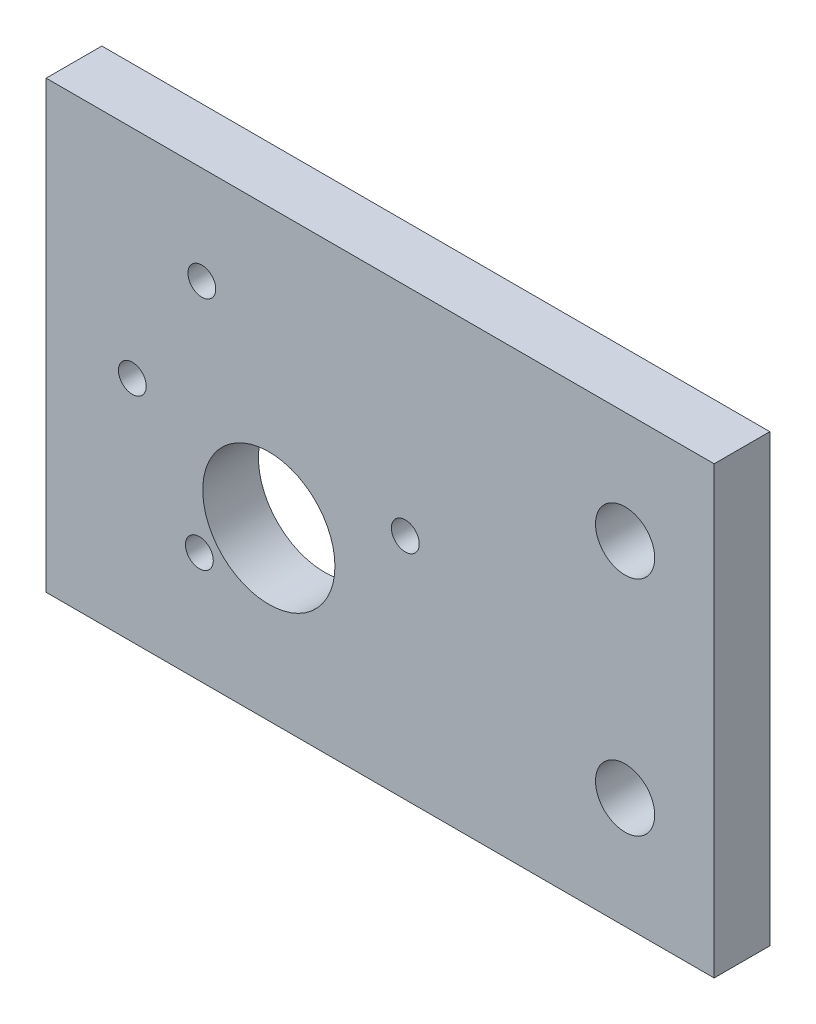
ISO-10303-21;
HEADER;
FILE_DESCRIPTION(('STEP AP214'),'2;1');
FILE_NAME('part.step','',(''),(''),'','','');
FILE_SCHEMA(('AUTOMOTIVE_DESIGN { 1 0 10303 214 1 1 1 1 }'));
ENDSEC;
DATA;
#1=APPLICATION_CONTEXT('core data for automotive mechanical design processes');
#2=APPLICATION_PROTOCOL_DEFINITION('international standard','automotive_design',2000,#1);
#3=PRODUCT_CONTEXT('',#1,'mechanical');
#4=PRODUCT('Part','Part','',(#3));
#5=PRODUCT_RELATED_PRODUCT_CATEGORY('part','',(#4));
#6=PRODUCT_DEFINITION_FORMATION('','',#4);
#7=PRODUCT_DEFINITION_CONTEXT('part definition',#1,'design');
#8=PRODUCT_DEFINITION('design','',#6,#7);
#9=PRODUCT_DEFINITION_SHAPE('','',#8);
#10=(LENGTH_UNIT() NAMED_UNIT(*) SI_UNIT(.MILLI.,.METRE.));
#11=(NAMED_UNIT(*) PLANE_ANGLE_UNIT() SI_UNIT($,.RADIAN.));
#12=(NAMED_UNIT(*) SI_UNIT($,.STERADIAN.) SOLID_ANGLE_UNIT());
#13=UNCERTAINTY_MEASURE_WITH_UNIT(LENGTH_MEASURE(1.E-05),#10,'distance_accuracy_value','');
#14=(GEOMETRIC_REPRESENTATION_CONTEXT(3) GLOBAL_UNCERTAINTY_ASSIGNED_CONTEXT((#13)) GLOBAL_UNIT_ASSIGNED_CONTEXT((#10,
#11,#12)) REPRESENTATION_CONTEXT('',''));
#15=CARTESIAN_POINT('',(0.,0.,0.));
#16=DIRECTION('',(0.,0.,1.));
#17=DIRECTION('',(1.,0.,0.));
#18=AXIS2_PLACEMENT_3D('',#15,#16,#17);
#19=CARTESIAN_POINT('',(38.1,25.4,6.35));
#20=DIRECTION('',(-1.,0.,0.));
#21=DIRECTION('',(0.,0.,1.));
#22=AXIS2_PLACEMENT_3D('',#19,#20,#21);
#23=PLANE('',#22);
#24=DIRECTION('',(0.,1.,0.));
#25=VECTOR('',#24,1.);
#26=CARTESIAN_POINT('',(38.1,25.4,0.));
#27=LINE('',#26,#25);
#28=CARTESIAN_POINT('',(38.1,-25.4,0.));
#29=VERTEX_POINT('',#28);
#30=CARTESIAN_POINT('',(38.1,25.4,0.));
#31=VERTEX_POINT('',#30);
#32=EDGE_CURVE('E95',#29,#31,#27,.T.);
#33=ORIENTED_EDGE('',*,*,#32,.T.);
#34=DIRECTION('',(0.,0.,-1.));
#35=VECTOR('',#34,1.);
#36=CARTESIAN_POINT('',(38.1,25.4,6.35));
#37=LINE('',#36,#35);
#38=CARTESIAN_POINT('',(38.1,25.4,6.35));
#39=VERTEX_POINT('',#38);
#40=EDGE_CURVE('E11',#39,#31,#37,.T.);
#41=ORIENTED_EDGE('',*,*,#40,.F.);
#42=DIRECTION('',(0.,1.,0.));
#43=VECTOR('',#42,1.);
#44=CARTESIAN_POINT('',(38.1,25.4,6.35));
#45=LINE('',#44,#43);
#46=CARTESIAN_POINT('',(38.1,-25.4,6.35));
#47=VERTEX_POINT('',#46);
#48=EDGE_CURVE('E83',#47,#39,#45,.T.);
#49=ORIENTED_EDGE('',*,*,#48,.F.);
#50=DIRECTION('',(0.,0.,-1.));
#51=VECTOR('',#50,1.);
#52=CARTESIAN_POINT('',(38.1,-25.4,6.35));
#53=LINE('',#52,#51);
#54=EDGE_CURVE('E91',#47,#29,#53,.T.);
#55=ORIENTED_EDGE('',*,*,#54,.T.);
#56=EDGE_LOOP('',(#33,#41,#49,#55));
#57=FACE_BOUND('',#56,.T.);
#58=ADVANCED_FACE('F32',(#57),#23,.F.);
#59=CARTESIAN_POINT('',(-38.1,25.4,6.35));
#60=DIRECTION('',(0.,-1.,0.));
#61=DIRECTION('',(0.,0.,-1.));
#62=AXIS2_PLACEMENT_3D('',#59,#60,#61);
#63=PLANE('',#62);
#64=DIRECTION('',(-1.,0.,0.));
#65=VECTOR('',#64,1.);
#66=CARTESIAN_POINT('',(-38.1,25.4,0.));
#67=LINE('',#66,#65);
#68=CARTESIAN_POINT('',(-38.1,25.4,0.));
#69=VERTEX_POINT('',#68);
#70=EDGE_CURVE('E87',#31,#69,#67,.T.);
#71=ORIENTED_EDGE('',*,*,#70,.T.);
#72=DIRECTION('',(0.,0.,-1.));
#73=VECTOR('',#72,1.);
#74=CARTESIAN_POINT('',(-38.1,25.4,6.35));
#75=LINE('',#74,#73);
#76=CARTESIAN_POINT('',(-38.1,25.4,6.35));
#77=VERTEX_POINT('',#76);
#78=EDGE_CURVE('E40',#77,#69,#75,.T.);
#79=ORIENTED_EDGE('',*,*,#78,.F.);
#80=DIRECTION('',(-1.,0.,0.));
#81=VECTOR('',#80,1.);
#82=CARTESIAN_POINT('',(-38.1,25.4,6.35));
#83=LINE('',#82,#81);
#84=EDGE_CURVE('E78',#39,#77,#83,.T.);
#85=ORIENTED_EDGE('',*,*,#84,.F.);
#86=ORIENTED_EDGE('',*,*,#40,.T.);
#87=EDGE_LOOP('',(#71,#79,#85,#86));
#88=FACE_BOUND('',#87,.T.);
#89=ADVANCED_FACE('F86',(#88),#63,.F.);
#90=CARTESIAN_POINT('',(-38.1,25.4,6.35));
#91=DIRECTION('',(1.,0.,0.));
#92=DIRECTION('',(0.,1.,0.));
#93=AXIS2_PLACEMENT_3D('',#90,#91,#92);
#94=PLANE('',#93);
#95=DIRECTION('',(0.,-1.,0.));
#96=VECTOR('',#95,1.);
#97=CARTESIAN_POINT('',(-38.1,25.4,0.));
#98=LINE('',#97,#96);
#99=CARTESIAN_POINT('',(-38.1,-25.4,0.));
#100=VERTEX_POINT('',#99);
#101=EDGE_CURVE('E65',#69,#100,#98,.T.);
#102=ORIENTED_EDGE('',*,*,#101,.T.);
#103=DIRECTION('',(0.,0.,-1.));
#104=VECTOR('',#103,1.);
#105=CARTESIAN_POINT('',(-38.1,-25.4,6.35));
#106=LINE('',#105,#104);
#107=CARTESIAN_POINT('',(-38.1,-25.4,6.35));
#108=VERTEX_POINT('',#107);
#109=EDGE_CURVE('E88',#108,#100,#106,.T.);
#110=ORIENTED_EDGE('',*,*,#109,.F.);
#111=DIRECTION('',(0.,-1.,0.));
#112=VECTOR('',#111,1.);
#113=CARTESIAN_POINT('',(-38.1,25.4,6.35));
#114=LINE('',#113,#112);
#115=EDGE_CURVE('E81',#77,#108,#114,.T.);
#116=ORIENTED_EDGE('',*,*,#115,.F.);
#117=ORIENTED_EDGE('',*,*,#78,.T.);
#118=EDGE_LOOP('',(#102,#110,#116,#117));
#119=FACE_BOUND('',#118,.T.);
#120=ADVANCED_FACE('F89',(#119),#94,.F.);
#121=CARTESIAN_POINT('',(-38.1,-25.4,6.35));
#122=DIRECTION('',(0.,1.,0.));
#123=DIRECTION('',(0.,0.,1.));
#124=AXIS2_PLACEMENT_3D('',#121,#122,#123);
#125=PLANE('',#124);
#126=DIRECTION('',(1.,0.,0.));
#127=VECTOR('',#126,1.);
#128=CARTESIAN_POINT('',(-38.1,-25.4,0.));
#129=LINE('',#128,#127);
#130=EDGE_CURVE('E71',#100,#29,#129,.T.);
#131=ORIENTED_EDGE('',*,*,#130,.T.);
#132=ORIENTED_EDGE('',*,*,#54,.F.);
#133=DIRECTION('',(1.,0.,0.));
#134=VECTOR('',#133,1.);
#135=CARTESIAN_POINT('',(-38.1,-25.4,6.35));
#136=LINE('',#135,#134);
#137=EDGE_CURVE('E48',#108,#47,#136,.T.);
#138=ORIENTED_EDGE('',*,*,#137,.F.);
#139=ORIENTED_EDGE('',*,*,#109,.T.);
#140=EDGE_LOOP('',(#131,#132,#138,#139));
#141=FACE_BOUND('',#140,.T.);
#142=ADVANCED_FACE('F103',(#141),#125,.F.);
#143=CARTESIAN_POINT('',(0.,0.,6.35));
#144=DIRECTION('',(0.,0.,1.));
#145=DIRECTION('',(1.,0.,0.));
#146=AXIS2_PLACEMENT_3D('',#143,#144,#145);
#147=PLANE('',#146);
#148=CARTESIAN_POINT('',(27.94,12.7,6.35));
#149=DIRECTION('',(0.,0.,1.));
#150=DIRECTION('',(1.,0.,0.));
#151=AXIS2_PLACEMENT_3D('',#148,#149,#150);
#152=CIRCLE('',#151,3.3782);
#153=CARTESIAN_POINT('',(31.3182,12.7,6.35));
#154=VERTEX_POINT('',#153);
#155=EDGE_CURVE('E147',#154,#154,#152,.T.);
#156=ORIENTED_EDGE('',*,*,#155,.F.);
#157=EDGE_LOOP('',(#156));
#158=FACE_BOUND('',#157,.T.);
#159=CARTESIAN_POINT('',(27.94,-12.7,6.35));
#160=DIRECTION('',(0.,0.,1.));
#161=DIRECTION('',(1.,0.,0.));
#162=AXIS2_PLACEMENT_3D('',#159,#160,#161);
#163=CIRCLE('',#162,3.3782);
#164=CARTESIAN_POINT('',(31.3182,-12.7,6.35));
#165=VERTEX_POINT('',#164);
#166=EDGE_CURVE('E141',#165,#165,#163,.T.);
#167=ORIENTED_EDGE('',*,*,#166,.F.);
#168=EDGE_LOOP('',(#167));
#169=FACE_BOUND('',#168,.T.);
#170=CARTESIAN_POINT('',(-20.3454,14.224285390256,6.35));
#171=DIRECTION('',(0.,0.,1.));
#172=DIRECTION('',(1.,0.,0.));
#173=AXIS2_PLACEMENT_3D('',#170,#171,#172);
#174=CIRCLE('',#173,1.5875);
#175=CARTESIAN_POINT('',(-18.7579,14.224285390256,6.35));
#176=VERTEX_POINT('',#175);
#177=EDGE_CURVE('E135',#176,#176,#174,.T.);
#178=ORIENTED_EDGE('',*,*,#177,.F.);
#179=EDGE_LOOP('',(#178));
#180=FACE_BOUND('',#179,.T.);
#181=CARTESIAN_POINT('',(-28.2702,0.660400000000002,6.35));
#182=DIRECTION('',(0.,0.,1.));
#183=DIRECTION('',(1.,0.,0.));
#184=AXIS2_PLACEMENT_3D('',#181,#182,#183);
#185=CIRCLE('',#184,1.5875);
#186=CARTESIAN_POINT('',(-26.6827,0.660400000000002,6.35));
#187=VERTEX_POINT('',#186);
#188=EDGE_CURVE('E129',#187,#187,#185,.T.);
#189=ORIENTED_EDGE('',*,*,#188,.F.);
#190=EDGE_LOOP('',(#189));
#191=FACE_BOUND('',#190,.T.);
#192=CARTESIAN_POINT('',(-20.6248,-12.7421621804191,6.35));
#193=DIRECTION('',(0.,0.,1.));
#194=DIRECTION('',(1.,0.,0.));
#195=AXIS2_PLACEMENT_3D('',#192,#193,#194);
#196=CIRCLE('',#195,1.5875);
#197=CARTESIAN_POINT('',(-19.0373,-12.7421621804191,6.35));
#198=VERTEX_POINT('',#197);
#199=EDGE_CURVE('E123',#198,#198,#196,.T.);
#200=ORIENTED_EDGE('',*,*,#199,.F.);
#201=EDGE_LOOP('',(#200));
#202=FACE_BOUND('',#201,.T.);
#203=CARTESIAN_POINT('',(2.8702,0.660400000000002,6.35));
#204=DIRECTION('',(0.,0.,1.));
#205=DIRECTION('',(1.,0.,0.));
#206=AXIS2_PLACEMENT_3D('',#203,#204,#205);
#207=CIRCLE('',#206,1.5875);
#208=CARTESIAN_POINT('',(4.4577,0.660400000000002,6.35));
#209=VERTEX_POINT('',#208);
#210=EDGE_CURVE('E117',#209,#209,#207,.T.);
#211=ORIENTED_EDGE('',*,*,#210,.F.);
#212=EDGE_LOOP('',(#211));
#213=FACE_BOUND('',#212,.T.);
#214=CARTESIAN_POINT('',(-12.7,-6.35,6.35));
#215=DIRECTION('',(0.,0.,1.));
#216=DIRECTION('',(1.,0.,0.));
#217=AXIS2_PLACEMENT_3D('',#214,#215,#216);
#218=CIRCLE('',#217,7.540625);
#219=CARTESIAN_POINT('',(-5.159375,-6.35,6.35));
#220=VERTEX_POINT('',#219);
#221=EDGE_CURVE('E111',#220,#220,#218,.T.);
#222=ORIENTED_EDGE('',*,*,#221,.F.);
#223=EDGE_LOOP('',(#222));
#224=FACE_BOUND('',#223,.T.);
#225=ORIENTED_EDGE('',*,*,#48,.T.);
#226=ORIENTED_EDGE('',*,*,#84,.T.);
#227=ORIENTED_EDGE('',*,*,#115,.T.);
#228=ORIENTED_EDGE('',*,*,#137,.T.);
#229=EDGE_LOOP('',(#225,#226,#227,#228));
#230=FACE_BOUND('',#229,.T.);
#231=ADVANCED_FACE('F79',(#158,#169,#180,#191,#202,#213,#224,#230),#147,.T.);
#232=CARTESIAN_POINT('',(0.,0.,0.));
#233=DIRECTION('',(0.,0.,1.));
#234=DIRECTION('',(1.,0.,0.));
#235=AXIS2_PLACEMENT_3D('',#232,#233,#234);
#236=PLANE('',#235);
#237=CARTESIAN_POINT('',(27.94,12.7,0.));
#238=DIRECTION('',(0.,0.,1.));
#239=DIRECTION('',(1.,0.,0.));
#240=AXIS2_PLACEMENT_3D('',#237,#238,#239);
#241=CIRCLE('',#240,3.3782);
#242=CARTESIAN_POINT('',(31.3182,12.7,0.));
#243=VERTEX_POINT('',#242);
#244=EDGE_CURVE('E144',#243,#243,#241,.T.);
#245=ORIENTED_EDGE('',*,*,#244,.T.);
#246=EDGE_LOOP('',(#245));
#247=FACE_BOUND('',#246,.T.);
#248=CARTESIAN_POINT('',(27.94,-12.7,0.));
#249=DIRECTION('',(0.,0.,1.));
#250=DIRECTION('',(1.,0.,0.));
#251=AXIS2_PLACEMENT_3D('',#248,#249,#250);
#252=CIRCLE('',#251,3.3782);
#253=CARTESIAN_POINT('',(31.3182,-12.7,0.));
#254=VERTEX_POINT('',#253);
#255=EDGE_CURVE('E138',#254,#254,#252,.T.);
#256=ORIENTED_EDGE('',*,*,#255,.T.);
#257=EDGE_LOOP('',(#256));
#258=FACE_BOUND('',#257,.T.);
#259=CARTESIAN_POINT('',(-20.3454,14.224285390256,0.));
#260=DIRECTION('',(0.,0.,1.));
#261=DIRECTION('',(1.,0.,0.));
#262=AXIS2_PLACEMENT_3D('',#259,#260,#261);
#263=CIRCLE('',#262,1.5875);
#264=CARTESIAN_POINT('',(-18.7579,14.224285390256,0.));
#265=VERTEX_POINT('',#264);
#266=EDGE_CURVE('E132',#265,#265,#263,.T.);
#267=ORIENTED_EDGE('',*,*,#266,.T.);
#268=EDGE_LOOP('',(#267));
#269=FACE_BOUND('',#268,.T.);
#270=CARTESIAN_POINT('',(-28.2702,0.660400000000002,0.));
#271=DIRECTION('',(0.,0.,1.));
#272=DIRECTION('',(1.,0.,0.));
#273=AXIS2_PLACEMENT_3D('',#270,#271,#272);
#274=CIRCLE('',#273,1.5875);
#275=CARTESIAN_POINT('',(-26.6827,0.660400000000002,0.));
#276=VERTEX_POINT('',#275);
#277=EDGE_CURVE('E126',#276,#276,#274,.T.);
#278=ORIENTED_EDGE('',*,*,#277,.T.);
#279=EDGE_LOOP('',(#278));
#280=FACE_BOUND('',#279,.T.);
#281=CARTESIAN_POINT('',(-20.6248,-12.7421621804191,0.));
#282=DIRECTION('',(0.,0.,1.));
#283=DIRECTION('',(1.,0.,0.));
#284=AXIS2_PLACEMENT_3D('',#281,#282,#283);
#285=CIRCLE('',#284,1.5875);
#286=CARTESIAN_POINT('',(-19.0373,-12.7421621804191,0.));
#287=VERTEX_POINT('',#286);
#288=EDGE_CURVE('E120',#287,#287,#285,.T.);
#289=ORIENTED_EDGE('',*,*,#288,.T.);
#290=EDGE_LOOP('',(#289));
#291=FACE_BOUND('',#290,.T.);
#292=CARTESIAN_POINT('',(2.8702,0.660400000000002,0.));
#293=DIRECTION('',(0.,0.,1.));
#294=DIRECTION('',(1.,0.,0.));
#295=AXIS2_PLACEMENT_3D('',#292,#293,#294);
#296=CIRCLE('',#295,1.5875);
#297=CARTESIAN_POINT('',(4.4577,0.660400000000002,0.));
#298=VERTEX_POINT('',#297);
#299=EDGE_CURVE('E114',#298,#298,#296,.T.);
#300=ORIENTED_EDGE('',*,*,#299,.T.);
#301=EDGE_LOOP('',(#300));
#302=FACE_BOUND('',#301,.T.);
#303=CARTESIAN_POINT('',(-12.7,-6.35,0.));
#304=DIRECTION('',(0.,0.,1.));
#305=DIRECTION('',(1.,0.,0.));
#306=AXIS2_PLACEMENT_3D('',#303,#304,#305);
#307=CIRCLE('',#306,7.540625);
#308=CARTESIAN_POINT('',(-5.159375,-6.35,0.));
#309=VERTEX_POINT('',#308);
#310=EDGE_CURVE('E98',#309,#309,#307,.T.);
#311=ORIENTED_EDGE('',*,*,#310,.T.);
#312=EDGE_LOOP('',(#311));
#313=FACE_BOUND('',#312,.T.);
#314=ORIENTED_EDGE('',*,*,#32,.F.);
#315=ORIENTED_EDGE('',*,*,#130,.F.);
#316=ORIENTED_EDGE('',*,*,#101,.F.);
#317=ORIENTED_EDGE('',*,*,#70,.F.);
#318=EDGE_LOOP('',(#314,#315,#316,#317));
#319=FACE_BOUND('',#318,.T.);
#320=ADVANCED_FACE('F106',(#247,#258,#269,#280,#291,#302,#313,#319),#236,.F.);
#321=CARTESIAN_POINT('',(-12.7,-6.35,6.35));
#322=DIRECTION('',(0.,0.,1.));
#323=DIRECTION('',(1.,0.,0.));
#324=AXIS2_PLACEMENT_3D('',#321,#322,#323);
#325=CYLINDRICAL_SURFACE('',#324,7.540625);
#326=ORIENTED_EDGE('',*,*,#310,.F.);
#327=EDGE_LOOP('',(#326));
#328=FACE_BOUND('',#327,.T.);
#329=ORIENTED_EDGE('',*,*,#221,.T.);
#330=EDGE_LOOP('',(#329));
#331=FACE_BOUND('',#330,.T.);
#332=ADVANCED_FACE('F168',(#328,#331),#325,.F.);
#333=CARTESIAN_POINT('',(2.8702,0.660400000000002,6.35));
#334=DIRECTION('',(0.,0.,1.));
#335=DIRECTION('',(1.,0.,0.));
#336=AXIS2_PLACEMENT_3D('',#333,#334,#335);
#337=CYLINDRICAL_SURFACE('',#336,1.5875);
#338=ORIENTED_EDGE('',*,*,#299,.F.);
#339=EDGE_LOOP('',(#338));
#340=FACE_BOUND('',#339,.T.);
#341=ORIENTED_EDGE('',*,*,#210,.T.);
#342=EDGE_LOOP('',(#341));
#343=FACE_BOUND('',#342,.T.);
#344=ADVANCED_FACE('F170',(#340,#343),#337,.F.);
#345=CARTESIAN_POINT('',(-20.6248,-12.7421621804191,6.35));
#346=DIRECTION('',(0.,0.,1.));
#347=DIRECTION('',(1.,0.,0.));
#348=AXIS2_PLACEMENT_3D('',#345,#346,#347);
#349=CYLINDRICAL_SURFACE('',#348,1.5875);
#350=ORIENTED_EDGE('',*,*,#288,.F.);
#351=EDGE_LOOP('',(#350));
#352=FACE_BOUND('',#351,.T.);
#353=ORIENTED_EDGE('',*,*,#199,.T.);
#354=EDGE_LOOP('',(#353));
#355=FACE_BOUND('',#354,.T.);
#356=ADVANCED_FACE('F177',(#352,#355),#349,.F.);
#357=CARTESIAN_POINT('',(-28.2702,0.660400000000002,6.35));
#358=DIRECTION('',(0.,0.,1.));
#359=DIRECTION('',(1.,0.,0.));
#360=AXIS2_PLACEMENT_3D('',#357,#358,#359);
#361=CYLINDRICAL_SURFACE('',#360,1.5875);
#362=ORIENTED_EDGE('',*,*,#277,.F.);
#363=EDGE_LOOP('',(#362));
#364=FACE_BOUND('',#363,.T.);
#365=ORIENTED_EDGE('',*,*,#188,.T.);
#366=EDGE_LOOP('',(#365));
#367=FACE_BOUND('',#366,.T.);
#368=ADVANCED_FACE('F236',(#364,#367),#361,.F.);
#369=CARTESIAN_POINT('',(-20.3454,14.224285390256,6.35));
#370=DIRECTION('',(0.,0.,1.));
#371=DIRECTION('',(1.,0.,0.));
#372=AXIS2_PLACEMENT_3D('',#369,#370,#371);
#373=CYLINDRICAL_SURFACE('',#372,1.5875);
#374=ORIENTED_EDGE('',*,*,#266,.F.);
#375=EDGE_LOOP('',(#374));
#376=FACE_BOUND('',#375,.T.);
#377=ORIENTED_EDGE('',*,*,#177,.T.);
#378=EDGE_LOOP('',(#377));
#379=FACE_BOUND('',#378,.T.);
#380=ADVANCED_FACE('F217',(#376,#379),#373,.F.);
#381=CARTESIAN_POINT('',(27.94,-12.7,6.35));
#382=DIRECTION('',(0.,0.,1.));
#383=DIRECTION('',(1.,0.,0.));
#384=AXIS2_PLACEMENT_3D('',#381,#382,#383);
#385=CYLINDRICAL_SURFACE('',#384,3.3782);
#386=ORIENTED_EDGE('',*,*,#255,.F.);
#387=EDGE_LOOP('',(#386));
#388=FACE_BOUND('',#387,.T.);
#389=ORIENTED_EDGE('',*,*,#166,.T.);
#390=EDGE_LOOP('',(#389));
#391=FACE_BOUND('',#390,.T.);
#392=ADVANCED_FACE('F212',(#388,#391),#385,.F.);
#393=CARTESIAN_POINT('',(27.94,12.7,6.35));
#394=DIRECTION('',(0.,0.,1.));
#395=DIRECTION('',(1.,0.,0.));
#396=AXIS2_PLACEMENT_3D('',#393,#394,#395);
#397=CYLINDRICAL_SURFACE('',#396,3.3782);
#398=ORIENTED_EDGE('',*,*,#244,.F.);
#399=EDGE_LOOP('',(#398));
#400=FACE_BOUND('',#399,.T.);
#401=ORIENTED_EDGE('',*,*,#155,.T.);
#402=EDGE_LOOP('',(#401));
#403=FACE_BOUND('',#402,.T.);
#404=ADVANCED_FACE('F151',(#400,#403),#397,.F.);
#405=CLOSED_SHELL('',(#58,#89,#120,#142,#231,#320,#332,#344,#356,#368,#380,#392,#404));
#406=MANIFOLD_SOLID_BREP('B2',#405);
#407=ADVANCED_BREP_SHAPE_REPRESENTATION('',(#18,#406),#14);
#408=SHAPE_DEFINITION_REPRESENTATION(#9,#407);
ENDSEC;
END-ISO-10303-21;
